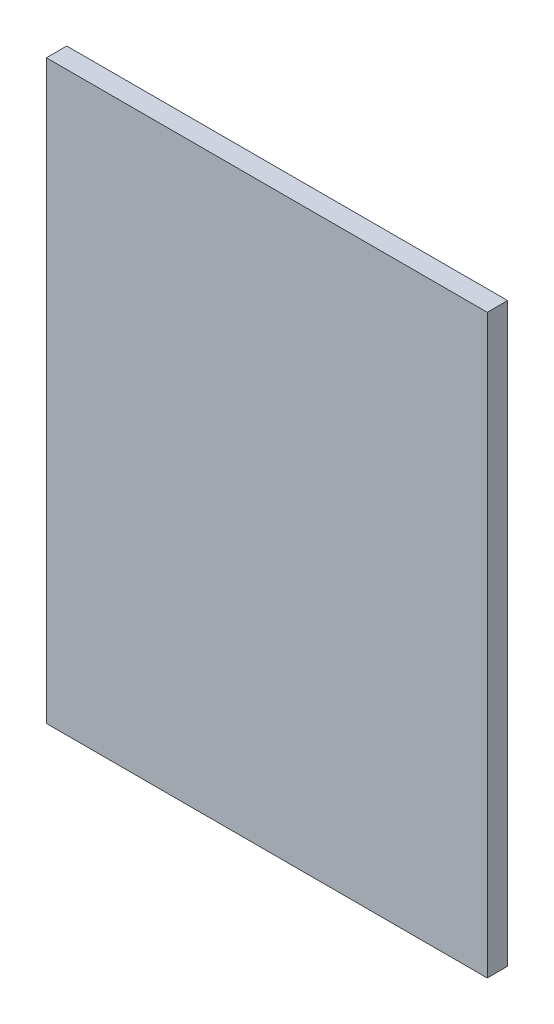
ISO-10303-21;
HEADER;
FILE_DESCRIPTION(('STEP AP214'),'2;1');
FILE_NAME('part.step','',(''),(''),'','','');
FILE_SCHEMA(('AUTOMOTIVE_DESIGN { 1 0 10303 214 1 1 1 1 }'));
ENDSEC;
DATA;
#1=APPLICATION_CONTEXT('core data for automotive mechanical design processes');
#2=APPLICATION_PROTOCOL_DEFINITION('international standard','automotive_design',2000,#1);
#3=PRODUCT_CONTEXT('',#1,'mechanical');
#4=PRODUCT('Part','Part','',(#3));
#5=PRODUCT_RELATED_PRODUCT_CATEGORY('part','',(#4));
#6=PRODUCT_DEFINITION_FORMATION('','',#4);
#7=PRODUCT_DEFINITION_CONTEXT('part definition',#1,'design');
#8=PRODUCT_DEFINITION('design','',#6,#7);
#9=PRODUCT_DEFINITION_SHAPE('','',#8);
#10=(LENGTH_UNIT() NAMED_UNIT(*) SI_UNIT(.MILLI.,.METRE.));
#11=(NAMED_UNIT(*) PLANE_ANGLE_UNIT() SI_UNIT($,.RADIAN.));
#12=(NAMED_UNIT(*) SI_UNIT($,.STERADIAN.) SOLID_ANGLE_UNIT());
#13=UNCERTAINTY_MEASURE_WITH_UNIT(LENGTH_MEASURE(1.E-05),#10,'distance_accuracy_value','');
#14=(GEOMETRIC_REPRESENTATION_CONTEXT(3) GLOBAL_UNCERTAINTY_ASSIGNED_CONTEXT((#13)) GLOBAL_UNIT_ASSIGNED_CONTEXT((#10,
#11,#12)) REPRESENTATION_CONTEXT('',''));
#15=CARTESIAN_POINT('',(0.,0.,0.));
#16=DIRECTION('',(0.,0.,1.));
#17=DIRECTION('',(1.,0.,0.));
#18=AXIS2_PLACEMENT_3D('',#15,#16,#17);
#19=CARTESIAN_POINT('',(0.,0.,30.));
#20=DIRECTION('',(1.,0.,0.));
#21=DIRECTION('',(0.,0.,-1.));
#22=AXIS2_PLACEMENT_3D('',#19,#20,#21);
#23=PLANE('',#22);
#24=DIRECTION('',(0.,-1.,0.));
#25=VECTOR('',#24,1.);
#26=CARTESIAN_POINT('',(0.,0.,0.));
#27=LINE('',#26,#25);
#28=CARTESIAN_POINT('',(0.,850.,0.));
#29=VERTEX_POINT('',#28);
#30=CARTESIAN_POINT('',(0.,0.,0.));
#31=VERTEX_POINT('',#30);
#32=EDGE_CURVE('E106',#29,#31,#27,.T.);
#33=ORIENTED_EDGE('',*,*,#32,.T.);
#34=DIRECTION('',(0.,0.,-1.));
#35=VECTOR('',#34,1.);
#36=CARTESIAN_POINT('',(0.,0.,30.));
#37=LINE('',#36,#35);
#38=CARTESIAN_POINT('',(0.,0.,30.));
#39=VERTEX_POINT('',#38);
#40=EDGE_CURVE('E11',#39,#31,#37,.T.);
#41=ORIENTED_EDGE('',*,*,#40,.F.);
#42=DIRECTION('',(0.,-1.,0.));
#43=VECTOR('',#42,1.);
#44=CARTESIAN_POINT('',(0.,0.,30.));
#45=LINE('',#44,#43);
#46=CARTESIAN_POINT('',(0.,850.,30.));
#47=VERTEX_POINT('',#46);
#48=EDGE_CURVE('E92',#47,#39,#45,.T.);
#49=ORIENTED_EDGE('',*,*,#48,.F.);
#50=DIRECTION('',(0.,0.,-1.));
#51=VECTOR('',#50,1.);
#52=CARTESIAN_POINT('',(0.,850.,30.));
#53=LINE('',#52,#51);
#54=EDGE_CURVE('E105',#47,#29,#53,.T.);
#55=ORIENTED_EDGE('',*,*,#54,.T.);
#56=EDGE_LOOP('',(#33,#41,#49,#55));
#57=FACE_BOUND('',#56,.T.);
#58=ADVANCED_FACE('F43',(#57),#23,.F.);
#59=CARTESIAN_POINT('',(0.,0.,30.));
#60=DIRECTION('',(0.,1.,0.));
#61=DIRECTION('',(0.,0.,1.));
#62=AXIS2_PLACEMENT_3D('',#59,#60,#61);
#63=PLANE('',#62);
#64=DIRECTION('',(1.,0.,0.));
#65=VECTOR('',#64,1.);
#66=CARTESIAN_POINT('',(0.,0.,0.));
#67=LINE('',#66,#65);
#68=CARTESIAN_POINT('',(650.,0.,0.));
#69=VERTEX_POINT('',#68);
#70=EDGE_CURVE('E97',#31,#69,#67,.T.);
#71=ORIENTED_EDGE('',*,*,#70,.T.);
#72=DIRECTION('',(0.,0.,-1.));
#73=VECTOR('',#72,1.);
#74=CARTESIAN_POINT('',(650.,0.,30.));
#75=LINE('',#74,#73);
#76=CARTESIAN_POINT('',(650.,0.,30.));
#77=VERTEX_POINT('',#76);
#78=EDGE_CURVE('E51',#77,#69,#75,.T.);
#79=ORIENTED_EDGE('',*,*,#78,.F.);
#80=DIRECTION('',(1.,0.,0.));
#81=VECTOR('',#80,1.);
#82=CARTESIAN_POINT('',(0.,0.,30.));
#83=LINE('',#82,#81);
#84=EDGE_CURVE('E87',#39,#77,#83,.T.);
#85=ORIENTED_EDGE('',*,*,#84,.F.);
#86=ORIENTED_EDGE('',*,*,#40,.T.);
#87=EDGE_LOOP('',(#71,#79,#85,#86));
#88=FACE_BOUND('',#87,.T.);
#89=ADVANCED_FACE('F100',(#88),#63,.F.);
#90=CARTESIAN_POINT('',(650.,0.,30.));
#91=DIRECTION('',(-1.,0.,0.));
#92=DIRECTION('',(0.,0.,1.));
#93=AXIS2_PLACEMENT_3D('',#90,#91,#92);
#94=PLANE('',#93);
#95=DIRECTION('',(0.,1.,0.));
#96=VECTOR('',#95,1.);
#97=CARTESIAN_POINT('',(650.,0.,0.));
#98=LINE('',#97,#96);
#99=CARTESIAN_POINT('',(650.,850.,0.));
#100=VERTEX_POINT('',#99);
#101=EDGE_CURVE('E78',#69,#100,#98,.T.);
#102=ORIENTED_EDGE('',*,*,#101,.T.);
#103=DIRECTION('',(0.,0.,-1.));
#104=VECTOR('',#103,1.);
#105=CARTESIAN_POINT('',(650.,850.,30.));
#106=LINE('',#105,#104);
#107=CARTESIAN_POINT('',(650.,850.,30.));
#108=VERTEX_POINT('',#107);
#109=EDGE_CURVE('E98',#108,#100,#106,.T.);
#110=ORIENTED_EDGE('',*,*,#109,.F.);
#111=DIRECTION('',(0.,1.,0.));
#112=VECTOR('',#111,1.);
#113=CARTESIAN_POINT('',(650.,0.,30.));
#114=LINE('',#113,#112);
#115=EDGE_CURVE('E95',#77,#108,#114,.T.);
#116=ORIENTED_EDGE('',*,*,#115,.F.);
#117=ORIENTED_EDGE('',*,*,#78,.T.);
#118=EDGE_LOOP('',(#102,#110,#116,#117));
#119=FACE_BOUND('',#118,.T.);
#120=ADVANCED_FACE('F99',(#119),#94,.F.);
#121=CARTESIAN_POINT('',(0.,850.,30.));
#122=DIRECTION('',(0.,-1.,0.));
#123=DIRECTION('',(0.,0.,-1.));
#124=AXIS2_PLACEMENT_3D('',#121,#122,#123);
#125=PLANE('',#124);
#126=DIRECTION('',(-1.,0.,0.));
#127=VECTOR('',#126,1.);
#128=CARTESIAN_POINT('',(0.,850.,0.));
#129=LINE('',#128,#127);
#130=EDGE_CURVE('E85',#100,#29,#129,.T.);
#131=ORIENTED_EDGE('',*,*,#130,.T.);
#132=ORIENTED_EDGE('',*,*,#54,.F.);
#133=DIRECTION('',(-1.,0.,0.));
#134=VECTOR('',#133,1.);
#135=CARTESIAN_POINT('',(0.,850.,30.));
#136=LINE('',#135,#134);
#137=EDGE_CURVE('E56',#108,#47,#136,.T.);
#138=ORIENTED_EDGE('',*,*,#137,.F.);
#139=ORIENTED_EDGE('',*,*,#109,.T.);
#140=EDGE_LOOP('',(#131,#132,#138,#139));
#141=FACE_BOUND('',#140,.T.);
#142=ADVANCED_FACE('F111',(#141),#125,.F.);
#143=CARTESIAN_POINT('',(0.,0.,30.));
#144=DIRECTION('',(0.,0.,-1.));
#145=DIRECTION('',(-1.,0.,0.));
#146=AXIS2_PLACEMENT_3D('',#143,#144,#145);
#147=PLANE('',#146);
#148=ORIENTED_EDGE('',*,*,#48,.T.);
#149=ORIENTED_EDGE('',*,*,#84,.T.);
#150=ORIENTED_EDGE('',*,*,#115,.T.);
#151=ORIENTED_EDGE('',*,*,#137,.T.);
#152=EDGE_LOOP('',(#148,#149,#150,#151));
#153=FACE_BOUND('',#152,.T.);
#154=ADVANCED_FACE('F89',(#153),#147,.F.);
#155=CARTESIAN_POINT('',(0.,0.,0.));
#156=DIRECTION('',(0.,0.,-1.));
#157=DIRECTION('',(-1.,0.,0.));
#158=AXIS2_PLACEMENT_3D('',#155,#156,#157);
#159=PLANE('',#158);
#160=ORIENTED_EDGE('',*,*,#32,.F.);
#161=ORIENTED_EDGE('',*,*,#130,.F.);
#162=ORIENTED_EDGE('',*,*,#101,.F.);
#163=ORIENTED_EDGE('',*,*,#70,.F.);
#164=EDGE_LOOP('',(#160,#161,#162,#163));
#165=FACE_BOUND('',#164,.T.);
#166=ADVANCED_FACE('F116',(#165),#159,.T.);
#167=CLOSED_SHELL('',(#58,#89,#120,#142,#154,#166));
#168=MANIFOLD_SOLID_BREP('B2',#167);
#169=ADVANCED_BREP_SHAPE_REPRESENTATION('',(#18,#168),#14);
#170=SHAPE_DEFINITION_REPRESENTATION(#9,#169);
ENDSEC;
END-ISO-10303-21;
